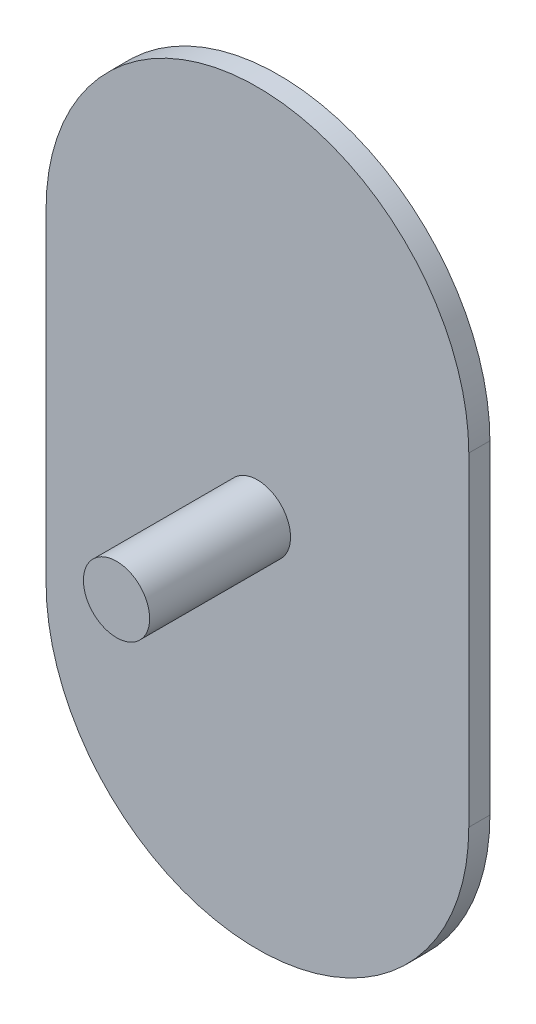
ISO-10303-21;
HEADER;
FILE_DESCRIPTION(('STEP AP214'),'2;1');
FILE_NAME('part.step','',(''),(''),'','','');
FILE_SCHEMA(('AUTOMOTIVE_DESIGN { 1 0 10303 214 1 1 1 1 }'));
ENDSEC;
DATA;
#1=APPLICATION_CONTEXT('core data for automotive mechanical design processes');
#2=APPLICATION_PROTOCOL_DEFINITION('international standard','automotive_design',2000,#1);
#3=PRODUCT_CONTEXT('',#1,'mechanical');
#4=PRODUCT('Part','Part','',(#3));
#5=PRODUCT_RELATED_PRODUCT_CATEGORY('part','',(#4));
#6=PRODUCT_DEFINITION_FORMATION('','',#4);
#7=PRODUCT_DEFINITION_CONTEXT('part definition',#1,'design');
#8=PRODUCT_DEFINITION('design','',#6,#7);
#9=PRODUCT_DEFINITION_SHAPE('','',#8);
#10=(LENGTH_UNIT() NAMED_UNIT(*) SI_UNIT(.MILLI.,.METRE.));
#11=(NAMED_UNIT(*) PLANE_ANGLE_UNIT() SI_UNIT($,.RADIAN.));
#12=(NAMED_UNIT(*) SI_UNIT($,.STERADIAN.) SOLID_ANGLE_UNIT());
#13=UNCERTAINTY_MEASURE_WITH_UNIT(LENGTH_MEASURE(1.E-05),#10,'distance_accuracy_value','');
#14=(GEOMETRIC_REPRESENTATION_CONTEXT(3) GLOBAL_UNCERTAINTY_ASSIGNED_CONTEXT((#13)) GLOBAL_UNIT_ASSIGNED_CONTEXT((#10,
#11,#12)) REPRESENTATION_CONTEXT('',''));
#15=CARTESIAN_POINT('',(0.,0.,0.));
#16=DIRECTION('',(0.,0.,1.));
#17=DIRECTION('',(1.,0.,0.));
#18=AXIS2_PLACEMENT_3D('',#15,#16,#17);
#19=CARTESIAN_POINT('',(0.,11.5,1.5));
#20=DIRECTION('',(0.,0.,-1.));
#21=DIRECTION('',(-1.,0.,0.));
#22=AXIS2_PLACEMENT_3D('',#19,#20,#21);
#23=CYLINDRICAL_SURFACE('',#22,15.);
#24=CARTESIAN_POINT('',(0.,11.5,0.));
#25=DIRECTION('',(0.,0.,1.));
#26=DIRECTION('',(-1.,0.,0.));
#27=AXIS2_PLACEMENT_3D('',#24,#25,#26);
#28=CIRCLE('',#27,15.);
#29=CARTESIAN_POINT('',(15.,11.5,0.));
#30=VERTEX_POINT('',#29);
#31=CARTESIAN_POINT('',(-15.,11.5,0.));
#32=VERTEX_POINT('',#31);
#33=EDGE_CURVE('E118',#30,#32,#28,.T.);
#34=ORIENTED_EDGE('',*,*,#33,.T.);
#35=DIRECTION('',(0.,0.,-1.));
#36=VECTOR('',#35,1.);
#37=CARTESIAN_POINT('',(-15.,11.5,1.5));
#38=LINE('',#37,#36);
#39=CARTESIAN_POINT('',(-15.,11.5,1.5));
#40=VERTEX_POINT('',#39);
#41=EDGE_CURVE('E107',#40,#32,#38,.T.);
#42=ORIENTED_EDGE('',*,*,#41,.F.);
#43=CARTESIAN_POINT('',(0.,11.5,1.5));
#44=DIRECTION('',(0.,0.,1.));
#45=DIRECTION('',(-1.,0.,0.));
#46=AXIS2_PLACEMENT_3D('',#43,#44,#45);
#47=CIRCLE('',#46,15.);
#48=CARTESIAN_POINT('',(15.,11.5,1.5));
#49=VERTEX_POINT('',#48);
#50=EDGE_CURVE('E99',#49,#40,#47,.T.);
#51=ORIENTED_EDGE('',*,*,#50,.F.);
#52=DIRECTION('',(0.,0.,-1.));
#53=VECTOR('',#52,1.);
#54=CARTESIAN_POINT('',(15.,11.5,1.5));
#55=LINE('',#54,#53);
#56=EDGE_CURVE('E114',#49,#30,#55,.T.);
#57=ORIENTED_EDGE('',*,*,#56,.T.);
#58=EDGE_LOOP('',(#34,#42,#51,#57));
#59=FACE_BOUND('',#58,.T.);
#60=ADVANCED_FACE('F45',(#59),#23,.T.);
#61=CARTESIAN_POINT('',(-15.,-11.5,1.5));
#62=DIRECTION('',(1.,0.,0.));
#63=DIRECTION('',(0.,0.,-1.));
#64=AXIS2_PLACEMENT_3D('',#61,#62,#63);
#65=PLANE('',#64);
#66=DIRECTION('',(0.,-1.,0.));
#67=VECTOR('',#66,1.);
#68=CARTESIAN_POINT('',(-15.,-11.5,0.));
#69=LINE('',#68,#67);
#70=CARTESIAN_POINT('',(-15.,-11.5,0.));
#71=VERTEX_POINT('',#70);
#72=EDGE_CURVE('E105',#32,#71,#69,.T.);
#73=ORIENTED_EDGE('',*,*,#72,.T.);
#74=DIRECTION('',(0.,0.,-1.));
#75=VECTOR('',#74,1.);
#76=CARTESIAN_POINT('',(-15.,-11.5,1.5));
#77=LINE('',#76,#75);
#78=CARTESIAN_POINT('',(-15.,-11.5,1.5));
#79=VERTEX_POINT('',#78);
#80=EDGE_CURVE('E103',#79,#71,#77,.T.);
#81=ORIENTED_EDGE('',*,*,#80,.F.);
#82=DIRECTION('',(0.,-1.,0.));
#83=VECTOR('',#82,1.);
#84=CARTESIAN_POINT('',(-15.,-11.5,1.5));
#85=LINE('',#84,#83);
#86=EDGE_CURVE('E94',#40,#79,#85,.T.);
#87=ORIENTED_EDGE('',*,*,#86,.F.);
#88=ORIENTED_EDGE('',*,*,#41,.T.);
#89=EDGE_LOOP('',(#73,#81,#87,#88));
#90=FACE_BOUND('',#89,.T.);
#91=ADVANCED_FACE('F104',(#90),#65,.F.);
#92=CARTESIAN_POINT('',(0.,-11.5,1.5));
#93=DIRECTION('',(0.,0.,-1.));
#94=DIRECTION('',(-1.,0.,0.));
#95=AXIS2_PLACEMENT_3D('',#92,#93,#94);
#96=CYLINDRICAL_SURFACE('',#95,15.);
#97=CARTESIAN_POINT('',(0.,-11.5,0.));
#98=DIRECTION('',(0.,0.,1.));
#99=DIRECTION('',(1.,0.,0.));
#100=AXIS2_PLACEMENT_3D('',#97,#98,#99);
#101=CIRCLE('',#100,15.);
#102=CARTESIAN_POINT('',(15.,-11.5,0.));
#103=VERTEX_POINT('',#102);
#104=EDGE_CURVE('E80',#71,#103,#101,.T.);
#105=ORIENTED_EDGE('',*,*,#104,.T.);
#106=DIRECTION('',(0.,0.,-1.));
#107=VECTOR('',#106,1.);
#108=CARTESIAN_POINT('',(15.,-11.5,1.5));
#109=LINE('',#108,#107);
#110=CARTESIAN_POINT('',(15.,-11.5,1.5));
#111=VERTEX_POINT('',#110);
#112=EDGE_CURVE('E108',#111,#103,#109,.T.);
#113=ORIENTED_EDGE('',*,*,#112,.F.);
#114=CARTESIAN_POINT('',(0.,-11.5,1.5));
#115=DIRECTION('',(0.,0.,1.));
#116=DIRECTION('',(1.,0.,0.));
#117=AXIS2_PLACEMENT_3D('',#114,#115,#116);
#118=CIRCLE('',#117,15.);
#119=EDGE_CURVE('E97',#79,#111,#118,.T.);
#120=ORIENTED_EDGE('',*,*,#119,.F.);
#121=ORIENTED_EDGE('',*,*,#80,.T.);
#122=EDGE_LOOP('',(#105,#113,#120,#121));
#123=FACE_BOUND('',#122,.T.);
#124=ADVANCED_FACE('F110',(#123),#96,.T.);
#125=CARTESIAN_POINT('',(15.,11.5,1.5));
#126=DIRECTION('',(-1.,0.,0.));
#127=DIRECTION('',(0.,0.,1.));
#128=AXIS2_PLACEMENT_3D('',#125,#126,#127);
#129=PLANE('',#128);
#130=DIRECTION('',(0.,1.,0.));
#131=VECTOR('',#130,1.);
#132=CARTESIAN_POINT('',(15.,11.5,0.));
#133=LINE('',#132,#131);
#134=EDGE_CURVE('E86',#103,#30,#133,.T.);
#135=ORIENTED_EDGE('',*,*,#134,.T.);
#136=ORIENTED_EDGE('',*,*,#56,.F.);
#137=DIRECTION('',(0.,1.,0.));
#138=VECTOR('',#137,1.);
#139=CARTESIAN_POINT('',(15.,11.5,1.5));
#140=LINE('',#139,#138);
#141=EDGE_CURVE('E63',#111,#49,#140,.T.);
#142=ORIENTED_EDGE('',*,*,#141,.F.);
#143=ORIENTED_EDGE('',*,*,#112,.T.);
#144=EDGE_LOOP('',(#135,#136,#142,#143));
#145=FACE_BOUND('',#144,.T.);
#146=ADVANCED_FACE('F169',(#145),#129,.F.);
#147=CARTESIAN_POINT('',(0.,11.5,1.5));
#148=DIRECTION('',(0.,0.,-1.));
#149=DIRECTION('',(-1.,0.,0.));
#150=AXIS2_PLACEMENT_3D('',#147,#148,#149);
#151=PLANE('',#150);
#152=CARTESIAN_POINT('',(0.,0.,1.5));
#153=DIRECTION('',(0.,0.,-1.));
#154=DIRECTION('',(-1.,0.,0.));
#155=AXIS2_PLACEMENT_3D('',#152,#153,#154);
#156=CIRCLE('',#155,2.35);
#157=CARTESIAN_POINT('',(-2.35,0.,1.5));
#158=VERTEX_POINT('',#157);
#159=EDGE_CURVE('E11',#158,#158,#156,.F.);
#160=ORIENTED_EDGE('',*,*,#159,.F.);
#161=EDGE_LOOP('',(#160));
#162=FACE_BOUND('',#161,.T.);
#163=ORIENTED_EDGE('',*,*,#50,.T.);
#164=ORIENTED_EDGE('',*,*,#86,.T.);
#165=ORIENTED_EDGE('',*,*,#119,.T.);
#166=ORIENTED_EDGE('',*,*,#141,.T.);
#167=EDGE_LOOP('',(#163,#164,#165,#166));
#168=FACE_BOUND('',#167,.T.);
#169=ADVANCED_FACE('F95',(#162,#168),#151,.F.);
#170=CARTESIAN_POINT('',(0.,11.5,0.));
#171=DIRECTION('',(0.,0.,-1.));
#172=DIRECTION('',(-1.,0.,0.));
#173=AXIS2_PLACEMENT_3D('',#170,#171,#172);
#174=PLANE('',#173);
#175=CARTESIAN_POINT('',(-3.47592832449396E-13,-12.5,0.));
#176=DIRECTION('',(0.,0.,-1.));
#177=DIRECTION('',(-1.,0.,0.));
#178=AXIS2_PLACEMENT_3D('',#175,#176,#177);
#179=CIRCLE('',#178,1.85);
#180=CARTESIAN_POINT('',(-1.85000000000035,-12.5,0.));
#181=VERTEX_POINT('',#180);
#182=EDGE_CURVE('E217',#181,#181,#179,.T.);
#183=ORIENTED_EDGE('',*,*,#182,.F.);
#184=EDGE_LOOP('',(#183));
#185=FACE_BOUND('',#184,.T.);
#186=CARTESIAN_POINT('',(0.,12.5,0.));
#187=DIRECTION('',(0.,0.,-1.));
#188=DIRECTION('',(-1.,0.,0.));
#189=AXIS2_PLACEMENT_3D('',#186,#187,#188);
#190=CIRCLE('',#189,1.85);
#191=CARTESIAN_POINT('',(-1.85,12.5,0.));
#192=VERTEX_POINT('',#191);
#193=EDGE_CURVE('E221',#192,#192,#190,.T.);
#194=ORIENTED_EDGE('',*,*,#193,.F.);
#195=EDGE_LOOP('',(#194));
#196=FACE_BOUND('',#195,.T.);
#197=ORIENTED_EDGE('',*,*,#33,.F.);
#198=ORIENTED_EDGE('',*,*,#134,.F.);
#199=ORIENTED_EDGE('',*,*,#104,.F.);
#200=ORIENTED_EDGE('',*,*,#72,.F.);
#201=EDGE_LOOP('',(#197,#198,#199,#200));
#202=FACE_BOUND('',#201,.T.);
#203=ADVANCED_FACE('F172',(#185,#196,#202),#174,.T.);
#204=CARTESIAN_POINT('',(0.,12.5,-1.5));
#205=DIRECTION('',(0.,0.,1.));
#206=DIRECTION('',(1.,0.,0.));
#207=AXIS2_PLACEMENT_3D('',#204,#205,#206);
#208=CYLINDRICAL_SURFACE('',#207,1.85);
#209=CARTESIAN_POINT('',(0.,12.5,-1.5));
#210=DIRECTION('',(0.,0.,-1.));
#211=DIRECTION('',(-1.,0.,0.));
#212=AXIS2_PLACEMENT_3D('',#209,#210,#211);
#213=CIRCLE('',#212,1.85);
#214=CARTESIAN_POINT('',(-1.85,12.5,-1.5));
#215=VERTEX_POINT('',#214);
#216=EDGE_CURVE('E122',#215,#215,#213,.T.);
#217=ORIENTED_EDGE('',*,*,#216,.F.);
#218=EDGE_LOOP('',(#217));
#219=FACE_BOUND('',#218,.T.);
#220=ORIENTED_EDGE('',*,*,#193,.T.);
#221=EDGE_LOOP('',(#220));
#222=FACE_BOUND('',#221,.T.);
#223=ADVANCED_FACE('F175',(#219,#222),#208,.T.);
#224=CARTESIAN_POINT('',(-3.47592832449396E-13,-12.5,-1.5));
#225=DIRECTION('',(0.,0.,1.));
#226=DIRECTION('',(1.,0.,0.));
#227=AXIS2_PLACEMENT_3D('',#224,#225,#226);
#228=CYLINDRICAL_SURFACE('',#227,1.85);
#229=CARTESIAN_POINT('',(-3.47592832449396E-13,-12.5,-1.5));
#230=DIRECTION('',(0.,0.,-1.));
#231=DIRECTION('',(-1.,0.,0.));
#232=AXIS2_PLACEMENT_3D('',#229,#230,#231);
#233=CIRCLE('',#232,1.85);
#234=CARTESIAN_POINT('',(-1.85000000000035,-12.5,-1.5));
#235=VERTEX_POINT('',#234);
#236=EDGE_CURVE('E216',#235,#235,#233,.T.);
#237=ORIENTED_EDGE('',*,*,#236,.F.);
#238=EDGE_LOOP('',(#237));
#239=FACE_BOUND('',#238,.T.);
#240=ORIENTED_EDGE('',*,*,#182,.T.);
#241=EDGE_LOOP('',(#240));
#242=FACE_BOUND('',#241,.T.);
#243=ADVANCED_FACE('F181',(#239,#242),#228,.T.);
#244=CARTESIAN_POINT('',(0.,12.5,-3.2));
#245=DIRECTION('',(0.,0.,-1.));
#246=DIRECTION('',(-1.,0.,0.));
#247=AXIS2_PLACEMENT_3D('',#244,#245,#246);
#248=PLANE('',#247);
#249=CARTESIAN_POINT('',(0.,12.5,-3.2));
#250=DIRECTION('',(0.,0.,-1.));
#251=DIRECTION('',(-1.,0.,0.));
#252=AXIS2_PLACEMENT_3D('',#249,#250,#251);
#253=CIRCLE('',#252,1.87262800667148);
#254=CARTESIAN_POINT('',(-1.87262800667148,12.5,-3.2));
#255=VERTEX_POINT('',#254);
#256=EDGE_CURVE('E55',#255,#255,#253,.T.);
#257=ORIENTED_EDGE('',*,*,#256,.T.);
#258=EDGE_LOOP('',(#257));
#259=FACE_BOUND('',#258,.T.);
#260=ADVANCED_FACE('F142',(#259),#248,.T.);
#261=CARTESIAN_POINT('',(0.,12.5,-1.5));
#262=DIRECTION('',(0.,0.,-1.));
#263=DIRECTION('',(-1.,0.,0.));
#264=AXIS2_PLACEMENT_3D('',#261,#262,#263);
#265=PLANE('',#264);
#266=ORIENTED_EDGE('',*,*,#216,.T.);
#267=EDGE_LOOP('',(#266));
#268=FACE_BOUND('',#267,.T.);
#269=CARTESIAN_POINT('',(0.,12.5,-1.5));
#270=DIRECTION('',(0.,0.,-1.));
#271=DIRECTION('',(-1.,0.,0.));
#272=AXIS2_PLACEMENT_3D('',#269,#270,#271);
#273=CIRCLE('',#272,3.85);
#274=CARTESIAN_POINT('',(-3.85,12.5,-1.5));
#275=VERTEX_POINT('',#274);
#276=EDGE_CURVE('E211',#275,#275,#273,.T.);
#277=ORIENTED_EDGE('',*,*,#276,.F.);
#278=EDGE_LOOP('',(#277));
#279=FACE_BOUND('',#278,.T.);
#280=ADVANCED_FACE('F186',(#268,#279),#265,.F.);
#281=CARTESIAN_POINT('',(-3.47592832449396E-13,-12.5,-3.2));
#282=DIRECTION('',(0.,0.,-1.));
#283=DIRECTION('',(-1.,0.,0.));
#284=AXIS2_PLACEMENT_3D('',#281,#282,#283);
#285=PLANE('',#284);
#286=CARTESIAN_POINT('',(-3.47592832449396E-13,-12.5,-3.2));
#287=DIRECTION('',(0.,0.,-1.));
#288=DIRECTION('',(-1.,0.,0.));
#289=AXIS2_PLACEMENT_3D('',#286,#287,#288);
#290=CIRCLE('',#289,1.87262800667148);
#291=CARTESIAN_POINT('',(-1.87262800667183,-12.5,-3.2));
#292=VERTEX_POINT('',#291);
#293=EDGE_CURVE('E135',#292,#292,#290,.T.);
#294=ORIENTED_EDGE('',*,*,#293,.T.);
#295=EDGE_LOOP('',(#294));
#296=FACE_BOUND('',#295,.T.);
#297=ADVANCED_FACE('F189',(#296),#285,.T.);
#298=CARTESIAN_POINT('',(-3.47592832449396E-13,-12.5,-1.5));
#299=DIRECTION('',(0.,0.,-1.));
#300=DIRECTION('',(-1.,0.,0.));
#301=AXIS2_PLACEMENT_3D('',#298,#299,#300);
#302=PLANE('',#301);
#303=ORIENTED_EDGE('',*,*,#236,.T.);
#304=EDGE_LOOP('',(#303));
#305=FACE_BOUND('',#304,.T.);
#306=CARTESIAN_POINT('',(-3.47592832449396E-13,-12.5,-1.5));
#307=DIRECTION('',(0.,0.,-1.));
#308=DIRECTION('',(-1.,0.,0.));
#309=AXIS2_PLACEMENT_3D('',#306,#307,#308);
#310=CIRCLE('',#309,3.85);
#311=CARTESIAN_POINT('',(-3.85000000000035,-12.5,-1.5));
#312=VERTEX_POINT('',#311);
#313=EDGE_CURVE('E207',#312,#312,#310,.T.);
#314=ORIENTED_EDGE('',*,*,#313,.F.);
#315=EDGE_LOOP('',(#314));
#316=FACE_BOUND('',#315,.T.);
#317=ADVANCED_FACE('F156',(#305,#316),#302,.F.);
#318=CARTESIAN_POINT('',(-3.47592832449396E-13,-12.5,-1.2));
#319=DIRECTION('',(0.,0.,1.));
#320=DIRECTION('',(1.,0.,0.));
#321=AXIS2_PLACEMENT_3D('',#318,#319,#320);
#322=DEGENERATE_TOROIDAL_SURFACE('',#321,1.87262800667148,2.,.T.);
#323=ORIENTED_EDGE('',*,*,#313,.T.);
#324=EDGE_LOOP('',(#323));
#325=FACE_BOUND('',#324,.T.);
#326=ORIENTED_EDGE('',*,*,#293,.F.);
#327=EDGE_LOOP('',(#326));
#328=FACE_BOUND('',#327,.T.);
#329=ADVANCED_FACE('F146',(#325,#328),#322,.T.);
#330=CARTESIAN_POINT('',(0.,12.5,-1.2));
#331=DIRECTION('',(0.,0.,1.));
#332=DIRECTION('',(1.,0.,0.));
#333=AXIS2_PLACEMENT_3D('',#330,#331,#332);
#334=DEGENERATE_TOROIDAL_SURFACE('',#333,1.87262800667148,2.,.T.);
#335=ORIENTED_EDGE('',*,*,#276,.T.);
#336=EDGE_LOOP('',(#335));
#337=FACE_BOUND('',#336,.T.);
#338=ORIENTED_EDGE('',*,*,#256,.F.);
#339=EDGE_LOOP('',(#338));
#340=FACE_BOUND('',#339,.T.);
#341=ADVANCED_FACE('F47',(#337,#340),#334,.T.);
#342=CARTESIAN_POINT('',(0.,0.,11.5));
#343=DIRECTION('',(0.,0.,-1.));
#344=DIRECTION('',(-1.,0.,0.));
#345=AXIS2_PLACEMENT_3D('',#342,#343,#344);
#346=CYLINDRICAL_SURFACE('',#345,2.35);
#347=CARTESIAN_POINT('',(0.,0.,11.5));
#348=DIRECTION('',(0.,0.,1.));
#349=DIRECTION('',(1.,0.,0.));
#350=AXIS2_PLACEMENT_3D('',#347,#348,#349);
#351=CIRCLE('',#350,2.35);
#352=CARTESIAN_POINT('',(2.35,0.,11.5));
#353=VERTEX_POINT('',#352);
#354=EDGE_CURVE('E205',#353,#353,#351,.T.);
#355=ORIENTED_EDGE('',*,*,#354,.F.);
#356=EDGE_LOOP('',(#355));
#357=FACE_BOUND('',#356,.T.);
#358=ORIENTED_EDGE('',*,*,#159,.T.);
#359=EDGE_LOOP('',(#358));
#360=FACE_BOUND('',#359,.T.);
#361=ADVANCED_FACE('F145',(#357,#360),#346,.T.);
#362=CARTESIAN_POINT('',(0.,0.,11.5));
#363=DIRECTION('',(0.,0.,1.));
#364=DIRECTION('',(1.,0.,0.));
#365=AXIS2_PLACEMENT_3D('',#362,#363,#364);
#366=PLANE('',#365);
#367=ORIENTED_EDGE('',*,*,#354,.T.);
#368=EDGE_LOOP('',(#367));
#369=FACE_BOUND('',#368,.T.);
#370=ADVANCED_FACE('F153',(#369),#366,.T.);
#371=CLOSED_SHELL('',(#60,#91,#124,#146,#169,#203,#223,#243,#260,#280,#297,#317,#329,#341,#361,#370));
#372=MANIFOLD_SOLID_BREP('B2',#371);
#373=ADVANCED_BREP_SHAPE_REPRESENTATION('',(#18,#372),#14);
#374=SHAPE_DEFINITION_REPRESENTATION(#9,#373);
ENDSEC;
END-ISO-10303-21;
